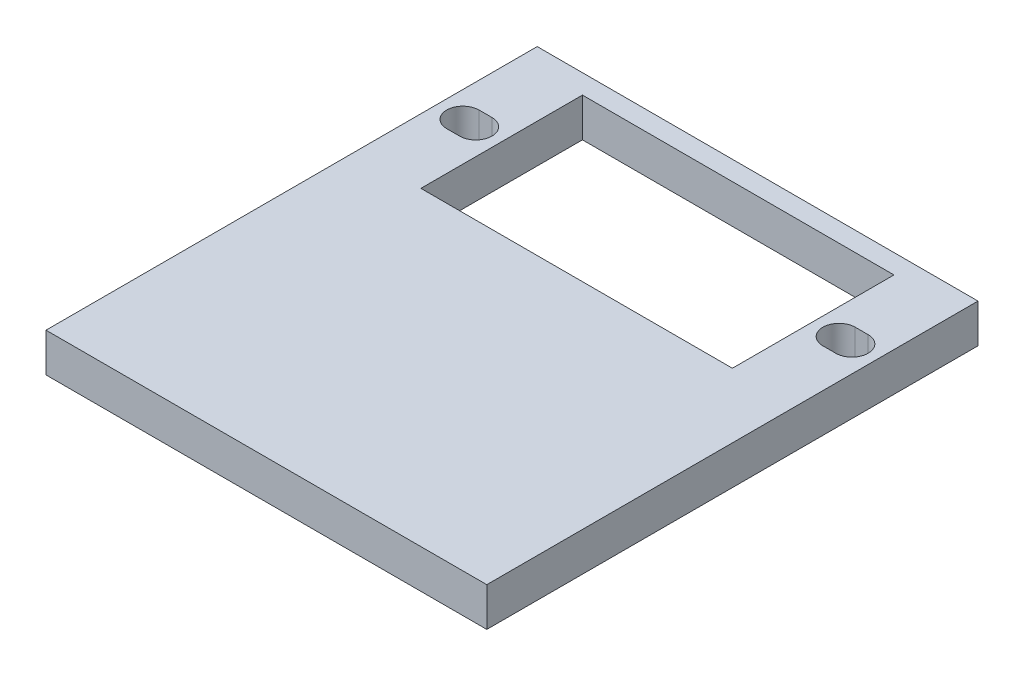
ISO-10303-21;
HEADER;
FILE_DESCRIPTION(('STEP AP214'),'2;1');
FILE_NAME('part.step','',(''),(''),'','','');
FILE_SCHEMA(('AUTOMOTIVE_DESIGN { 1 0 10303 214 1 1 1 1 }'));
ENDSEC;
DATA;
#1=APPLICATION_CONTEXT('core data for automotive mechanical design processes');
#2=APPLICATION_PROTOCOL_DEFINITION('international standard','automotive_design',2000,#1);
#3=PRODUCT_CONTEXT('',#1,'mechanical');
#4=PRODUCT('Part','Part','',(#3));
#5=PRODUCT_RELATED_PRODUCT_CATEGORY('part','',(#4));
#6=PRODUCT_DEFINITION_FORMATION('','',#4);
#7=PRODUCT_DEFINITION_CONTEXT('part definition',#1,'design');
#8=PRODUCT_DEFINITION('design','',#6,#7);
#9=PRODUCT_DEFINITION_SHAPE('','',#8);
#10=(LENGTH_UNIT() NAMED_UNIT(*) SI_UNIT(.MILLI.,.METRE.));
#11=(NAMED_UNIT(*) PLANE_ANGLE_UNIT() SI_UNIT($,.RADIAN.));
#12=(NAMED_UNIT(*) SI_UNIT($,.STERADIAN.) SOLID_ANGLE_UNIT());
#13=UNCERTAINTY_MEASURE_WITH_UNIT(LENGTH_MEASURE(1.E-05),#10,'distance_accuracy_value','');
#14=(GEOMETRIC_REPRESENTATION_CONTEXT(3) GLOBAL_UNCERTAINTY_ASSIGNED_CONTEXT((#13)) GLOBAL_UNIT_ASSIGNED_CONTEXT((#10,
#11,#12)) REPRESENTATION_CONTEXT('',''));
#15=CARTESIAN_POINT('',(0.,0.,0.));
#16=DIRECTION('',(0.,0.,1.));
#17=DIRECTION('',(1.,0.,0.));
#18=AXIS2_PLACEMENT_3D('',#15,#16,#17);
#19=CARTESIAN_POINT('',(0.,3.,-24.));
#20=DIRECTION('',(0.,0.,1.));
#21=DIRECTION('',(1.,0.,0.));
#22=AXIS2_PLACEMENT_3D('',#19,#20,#21);
#23=PLANE('',#22);
#24=DIRECTION('',(-1.,0.,0.));
#25=VECTOR('',#24,1.);
#26=CARTESIAN_POINT('',(0.,0.,-24.));
#27=LINE('',#26,#25);
#28=CARTESIAN_POINT('',(12.05,0.,-24.));
#29=VERTEX_POINT('',#28);
#30=CARTESIAN_POINT('',(-12.05,0.,-24.));
#31=VERTEX_POINT('',#30);
#32=EDGE_CURVE('E161',#29,#31,#27,.T.);
#33=ORIENTED_EDGE('',*,*,#32,.T.);
#34=DIRECTION('',(0.,-1.,0.));
#35=VECTOR('',#34,1.);
#36=CARTESIAN_POINT('',(-12.05,3.,-24.));
#37=LINE('',#36,#35);
#38=CARTESIAN_POINT('',(-12.05,3.,-24.));
#39=VERTEX_POINT('',#38);
#40=EDGE_CURVE('E11',#39,#31,#37,.T.);
#41=ORIENTED_EDGE('',*,*,#40,.F.);
#42=DIRECTION('',(-1.,0.,0.));
#43=VECTOR('',#42,1.);
#44=CARTESIAN_POINT('',(0.,3.,-24.));
#45=LINE('',#44,#43);
#46=CARTESIAN_POINT('',(12.05,3.,-24.));
#47=VERTEX_POINT('',#46);
#48=EDGE_CURVE('E131',#47,#39,#45,.T.);
#49=ORIENTED_EDGE('',*,*,#48,.F.);
#50=DIRECTION('',(0.,-1.,0.));
#51=VECTOR('',#50,1.);
#52=CARTESIAN_POINT('',(12.05,3.,-24.));
#53=LINE('',#52,#51);
#54=EDGE_CURVE('E211',#47,#29,#53,.T.);
#55=ORIENTED_EDGE('',*,*,#54,.T.);
#56=EDGE_LOOP('',(#33,#41,#49,#55));
#57=FACE_BOUND('',#56,.T.);
#58=ADVANCED_FACE('F35',(#57),#23,.F.);
#59=CARTESIAN_POINT('',(-12.05,3.,0.));
#60=DIRECTION('',(1.,0.,0.));
#61=DIRECTION('',(0.,0.,-1.));
#62=AXIS2_PLACEMENT_3D('',#59,#60,#61);
#63=PLANE('',#62);
#64=DIRECTION('',(0.,0.,1.));
#65=VECTOR('',#64,1.);
#66=CARTESIAN_POINT('',(-12.05,0.,0.));
#67=LINE('',#66,#65);
#68=CARTESIAN_POINT('',(-12.05,0.,-36.5));
#69=VERTEX_POINT('',#68);
#70=EDGE_CURVE('E116',#69,#31,#67,.T.);
#71=ORIENTED_EDGE('',*,*,#70,.F.);
#72=DIRECTION('',(0.,-1.,0.));
#73=VECTOR('',#72,1.);
#74=CARTESIAN_POINT('',(-12.05,3.,-36.5));
#75=LINE('',#74,#73);
#76=CARTESIAN_POINT('',(-12.05,3.,-36.5));
#77=VERTEX_POINT('',#76);
#78=EDGE_CURVE('E45',#77,#69,#75,.T.);
#79=ORIENTED_EDGE('',*,*,#78,.F.);
#80=DIRECTION('',(0.,0.,1.));
#81=VECTOR('',#80,1.);
#82=CARTESIAN_POINT('',(-12.05,3.,0.));
#83=LINE('',#82,#81);
#84=EDGE_CURVE('E114',#77,#39,#83,.T.);
#85=ORIENTED_EDGE('',*,*,#84,.T.);
#86=ORIENTED_EDGE('',*,*,#40,.T.);
#87=EDGE_LOOP('',(#71,#79,#85,#86));
#88=FACE_BOUND('',#87,.T.);
#89=ADVANCED_FACE('F113',(#88),#63,.T.);
#90=CARTESIAN_POINT('',(0.,3.,-36.5));
#91=DIRECTION('',(0.,0.,1.));
#92=DIRECTION('',(1.,0.,0.));
#93=AXIS2_PLACEMENT_3D('',#90,#91,#92);
#94=PLANE('',#93);
#95=DIRECTION('',(-1.,0.,0.));
#96=VECTOR('',#95,1.);
#97=CARTESIAN_POINT('',(0.,0.,-36.5));
#98=LINE('',#97,#96);
#99=CARTESIAN_POINT('',(12.05,0.,-36.5));
#100=VERTEX_POINT('',#99);
#101=EDGE_CURVE('E165',#100,#69,#98,.T.);
#102=ORIENTED_EDGE('',*,*,#101,.F.);
#103=DIRECTION('',(0.,-1.,0.));
#104=VECTOR('',#103,1.);
#105=CARTESIAN_POINT('',(12.05,3.,-36.5));
#106=LINE('',#105,#104);
#107=CARTESIAN_POINT('',(12.05,3.,-36.5));
#108=VERTEX_POINT('',#107);
#109=EDGE_CURVE('E137',#108,#100,#106,.T.);
#110=ORIENTED_EDGE('',*,*,#109,.F.);
#111=DIRECTION('',(-1.,0.,0.));
#112=VECTOR('',#111,1.);
#113=CARTESIAN_POINT('',(0.,3.,-36.5));
#114=LINE('',#113,#112);
#115=EDGE_CURVE('E128',#108,#77,#114,.T.);
#116=ORIENTED_EDGE('',*,*,#115,.T.);
#117=ORIENTED_EDGE('',*,*,#78,.T.);
#118=EDGE_LOOP('',(#102,#110,#116,#117));
#119=FACE_BOUND('',#118,.T.);
#120=ADVANCED_FACE('F135',(#119),#94,.T.);
#121=CARTESIAN_POINT('',(0.,3.,-38.));
#122=DIRECTION('',(0.,0.,1.));
#123=DIRECTION('',(1.,0.,0.));
#124=AXIS2_PLACEMENT_3D('',#121,#122,#123);
#125=PLANE('',#124);
#126=DIRECTION('',(-1.,0.,0.));
#127=VECTOR('',#126,1.);
#128=CARTESIAN_POINT('',(0.,0.,-38.));
#129=LINE('',#128,#127);
#130=CARTESIAN_POINT('',(17.05,0.,-38.));
#131=VERTEX_POINT('',#130);
#132=CARTESIAN_POINT('',(-17.05,0.,-38.));
#133=VERTEX_POINT('',#132);
#134=EDGE_CURVE('E167',#131,#133,#129,.T.);
#135=ORIENTED_EDGE('',*,*,#134,.T.);
#136=DIRECTION('',(0.,-1.,0.));
#137=VECTOR('',#136,1.);
#138=CARTESIAN_POINT('',(-17.05,3.,-38.));
#139=LINE('',#138,#137);
#140=CARTESIAN_POINT('',(-17.05,3.,-38.));
#141=VERTEX_POINT('',#140);
#142=EDGE_CURVE('E81',#141,#133,#139,.T.);
#143=ORIENTED_EDGE('',*,*,#142,.F.);
#144=DIRECTION('',(-1.,0.,0.));
#145=VECTOR('',#144,1.);
#146=CARTESIAN_POINT('',(0.,3.,-38.));
#147=LINE('',#146,#145);
#148=CARTESIAN_POINT('',(17.05,3.,-38.));
#149=VERTEX_POINT('',#148);
#150=EDGE_CURVE('E138',#149,#141,#147,.T.);
#151=ORIENTED_EDGE('',*,*,#150,.F.);
#152=DIRECTION('',(0.,-1.,0.));
#153=VECTOR('',#152,1.);
#154=CARTESIAN_POINT('',(17.05,3.,-38.));
#155=LINE('',#154,#153);
#156=EDGE_CURVE('E224',#149,#131,#155,.T.);
#157=ORIENTED_EDGE('',*,*,#156,.T.);
#158=EDGE_LOOP('',(#135,#143,#151,#157));
#159=FACE_BOUND('',#158,.T.);
#160=ADVANCED_FACE('F348',(#159),#125,.F.);
#161=CARTESIAN_POINT('',(-17.05,3.,0.));
#162=DIRECTION('',(-1.,0.,0.));
#163=DIRECTION('',(0.,0.,1.));
#164=AXIS2_PLACEMENT_3D('',#161,#162,#163);
#165=PLANE('',#164);
#166=DIRECTION('',(0.,0.,-1.));
#167=VECTOR('',#166,1.);
#168=CARTESIAN_POINT('',(-17.05,0.,0.));
#169=LINE('',#168,#167);
#170=CARTESIAN_POINT('',(-17.05,0.,0.));
#171=VERTEX_POINT('',#170);
#172=EDGE_CURVE('E169',#171,#133,#169,.T.);
#173=ORIENTED_EDGE('',*,*,#172,.F.);
#174=DIRECTION('',(0.,-1.,0.));
#175=VECTOR('',#174,1.);
#176=CARTESIAN_POINT('',(-17.05,3.,0.));
#177=LINE('',#176,#175);
#178=CARTESIAN_POINT('',(-17.05,3.,0.));
#179=VERTEX_POINT('',#178);
#180=EDGE_CURVE('E54',#179,#171,#177,.T.);
#181=ORIENTED_EDGE('',*,*,#180,.F.);
#182=DIRECTION('',(0.,0.,-1.));
#183=VECTOR('',#182,1.);
#184=CARTESIAN_POINT('',(-17.05,3.,0.));
#185=LINE('',#184,#183);
#186=EDGE_CURVE('E140',#179,#141,#185,.T.);
#187=ORIENTED_EDGE('',*,*,#186,.T.);
#188=ORIENTED_EDGE('',*,*,#142,.T.);
#189=EDGE_LOOP('',(#173,#181,#187,#188));
#190=FACE_BOUND('',#189,.T.);
#191=ADVANCED_FACE('F344',(#190),#165,.T.);
#192=CARTESIAN_POINT('',(-14.05,3.,-30.25));
#193=DIRECTION('',(0.,-1.,0.));
#194=DIRECTION('',(0.,0.,-1.));
#195=AXIS2_PLACEMENT_3D('',#192,#193,#194);
#196=CYLINDRICAL_SURFACE('',#195,1.25);
#197=CARTESIAN_POINT('',(-14.05,0.,-30.25));
#198=DIRECTION('',(0.,1.,0.));
#199=DIRECTION('',(0.,0.,1.));
#200=AXIS2_PLACEMENT_3D('',#197,#198,#199);
#201=CIRCLE('',#200,1.25);
#202=CARTESIAN_POINT('',(-14.05,0.,-29.));
#203=VERTEX_POINT('',#202);
#204=CARTESIAN_POINT('',(-14.05,0.,-31.5));
#205=VERTEX_POINT('',#204);
#206=EDGE_CURVE('E148',#203,#205,#201,.T.);
#207=ORIENTED_EDGE('',*,*,#206,.F.);
#208=DIRECTION('',(0.,-1.,0.));
#209=VECTOR('',#208,1.);
#210=CARTESIAN_POINT('',(-14.05,3.,-29.));
#211=LINE('',#210,#209);
#212=CARTESIAN_POINT('',(-14.05,3.,-29.));
#213=VERTEX_POINT('',#212);
#214=EDGE_CURVE('E39',#213,#203,#211,.T.);
#215=ORIENTED_EDGE('',*,*,#214,.F.);
#216=CARTESIAN_POINT('',(-14.05,3.,-30.25));
#217=DIRECTION('',(0.,1.,0.));
#218=DIRECTION('',(0.,0.,1.));
#219=AXIS2_PLACEMENT_3D('',#216,#217,#218);
#220=CIRCLE('',#219,1.25);
#221=CARTESIAN_POINT('',(-14.05,3.,-31.5));
#222=VERTEX_POINT('',#221);
#223=EDGE_CURVE('E175',#213,#222,#220,.T.);
#224=ORIENTED_EDGE('',*,*,#223,.T.);
#225=DIRECTION('',(0.,-1.,0.));
#226=VECTOR('',#225,1.);
#227=CARTESIAN_POINT('',(-14.05,3.,-31.5));
#228=LINE('',#227,#226);
#229=EDGE_CURVE('E147',#222,#205,#228,.T.);
#230=ORIENTED_EDGE('',*,*,#229,.T.);
#231=EDGE_LOOP('',(#207,#215,#224,#230));
#232=FACE_BOUND('',#231,.T.);
#233=ADVANCED_FACE('F37',(#232),#196,.F.);
#234=CARTESIAN_POINT('',(2.01227923213309E-13,3.,-28.9999999999999));
#235=DIRECTION('',(0.,0.,-1.));
#236=DIRECTION('',(-1.,0.,0.));
#237=AXIS2_PLACEMENT_3D('',#234,#235,#236);
#238=PLANE('',#237);
#239=DIRECTION('',(1.,0.,0.));
#240=VECTOR('',#239,1.);
#241=CARTESIAN_POINT('',(2.01227923213309E-13,0.,-28.9999999999999));
#242=LINE('',#241,#240);
#243=CARTESIAN_POINT('',(-15.05,0.,-29.));
#244=VERTEX_POINT('',#243);
#245=EDGE_CURVE('E151',#244,#203,#242,.T.);
#246=ORIENTED_EDGE('',*,*,#245,.F.);
#247=DIRECTION('',(0.,-1.,0.));
#248=VECTOR('',#247,1.);
#249=CARTESIAN_POINT('',(-15.05,3.,-29.));
#250=LINE('',#249,#248);
#251=CARTESIAN_POINT('',(-15.05,3.,-29.));
#252=VERTEX_POINT('',#251);
#253=EDGE_CURVE('E180',#252,#244,#250,.T.);
#254=ORIENTED_EDGE('',*,*,#253,.F.);
#255=DIRECTION('',(1.,0.,0.));
#256=VECTOR('',#255,1.);
#257=CARTESIAN_POINT('',(2.01227923213309E-13,3.,-28.9999999999999));
#258=LINE('',#257,#256);
#259=EDGE_CURVE('E189',#252,#213,#258,.T.);
#260=ORIENTED_EDGE('',*,*,#259,.T.);
#261=ORIENTED_EDGE('',*,*,#214,.T.);
#262=EDGE_LOOP('',(#246,#254,#260,#261));
#263=FACE_BOUND('',#262,.T.);
#264=ADVANCED_FACE('F187',(#263),#238,.T.);
#265=CARTESIAN_POINT('',(-15.05,3.,-30.25));
#266=DIRECTION('',(0.,-1.,0.));
#267=DIRECTION('',(0.,0.,-1.));
#268=AXIS2_PLACEMENT_3D('',#265,#266,#267);
#269=CYLINDRICAL_SURFACE('',#268,1.25);
#270=CARTESIAN_POINT('',(-15.05,0.,-30.25));
#271=DIRECTION('',(0.,1.,0.));
#272=DIRECTION('',(0.,0.,1.));
#273=AXIS2_PLACEMENT_3D('',#270,#271,#272);
#274=CIRCLE('',#273,1.25);
#275=CARTESIAN_POINT('',(-15.05,0.,-31.5));
#276=VERTEX_POINT('',#275);
#277=EDGE_CURVE('E155',#276,#244,#274,.T.);
#278=ORIENTED_EDGE('',*,*,#277,.F.);
#279=DIRECTION('',(0.,-1.,0.));
#280=VECTOR('',#279,1.);
#281=CARTESIAN_POINT('',(-15.05,3.,-31.5));
#282=LINE('',#281,#280);
#283=CARTESIAN_POINT('',(-15.05,3.,-31.5));
#284=VERTEX_POINT('',#283);
#285=EDGE_CURVE('E179',#284,#276,#282,.T.);
#286=ORIENTED_EDGE('',*,*,#285,.F.);
#287=CARTESIAN_POINT('',(-15.05,3.,-30.25));
#288=DIRECTION('',(0.,1.,0.));
#289=DIRECTION('',(0.,0.,1.));
#290=AXIS2_PLACEMENT_3D('',#287,#288,#289);
#291=CIRCLE('',#290,1.25);
#292=EDGE_CURVE('E198',#284,#252,#291,.T.);
#293=ORIENTED_EDGE('',*,*,#292,.T.);
#294=ORIENTED_EDGE('',*,*,#253,.T.);
#295=EDGE_LOOP('',(#278,#286,#293,#294));
#296=FACE_BOUND('',#295,.T.);
#297=ADVANCED_FACE('F195',(#296),#269,.F.);
#298=CARTESIAN_POINT('',(0.,3.,-31.5));
#299=DIRECTION('',(0.,0.,-1.));
#300=DIRECTION('',(-1.,0.,0.));
#301=AXIS2_PLACEMENT_3D('',#298,#299,#300);
#302=PLANE('',#301);
#303=DIRECTION('',(1.,0.,0.));
#304=VECTOR('',#303,1.);
#305=CARTESIAN_POINT('',(0.,0.,-31.5));
#306=LINE('',#305,#304);
#307=EDGE_CURVE('E158',#276,#205,#306,.T.);
#308=ORIENTED_EDGE('',*,*,#307,.T.);
#309=ORIENTED_EDGE('',*,*,#229,.F.);
#310=DIRECTION('',(1.,0.,0.));
#311=VECTOR('',#310,1.);
#312=CARTESIAN_POINT('',(0.,3.,-31.5));
#313=LINE('',#312,#311);
#314=EDGE_CURVE('E200',#284,#222,#313,.T.);
#315=ORIENTED_EDGE('',*,*,#314,.F.);
#316=ORIENTED_EDGE('',*,*,#285,.T.);
#317=EDGE_LOOP('',(#308,#309,#315,#316));
#318=FACE_BOUND('',#317,.T.);
#319=ADVANCED_FACE('F201',(#318),#302,.F.);
#320=CARTESIAN_POINT('',(0.,3.,0.));
#321=DIRECTION('',(0.,0.,1.));
#322=DIRECTION('',(1.,0.,0.));
#323=AXIS2_PLACEMENT_3D('',#320,#321,#322);
#324=PLANE('',#323);
#325=DIRECTION('',(-1.,0.,0.));
#326=VECTOR('',#325,1.);
#327=CARTESIAN_POINT('',(0.,0.,0.));
#328=LINE('',#327,#326);
#329=CARTESIAN_POINT('',(17.05,0.,0.));
#330=VERTEX_POINT('',#329);
#331=EDGE_CURVE('E172',#330,#171,#328,.T.);
#332=ORIENTED_EDGE('',*,*,#331,.F.);
#333=DIRECTION('',(0.,-1.,0.));
#334=VECTOR('',#333,1.);
#335=CARTESIAN_POINT('',(17.05,3.,0.));
#336=LINE('',#335,#334);
#337=CARTESIAN_POINT('',(17.05,3.,0.));
#338=VERTEX_POINT('',#337);
#339=EDGE_CURVE('E152',#338,#330,#336,.T.);
#340=ORIENTED_EDGE('',*,*,#339,.F.);
#341=DIRECTION('',(-1.,0.,0.));
#342=VECTOR('',#341,1.);
#343=CARTESIAN_POINT('',(0.,3.,0.));
#344=LINE('',#343,#342);
#345=EDGE_CURVE('E145',#338,#179,#344,.T.);
#346=ORIENTED_EDGE('',*,*,#345,.T.);
#347=ORIENTED_EDGE('',*,*,#180,.T.);
#348=EDGE_LOOP('',(#332,#340,#346,#347));
#349=FACE_BOUND('',#348,.T.);
#350=ADVANCED_FACE('F338',(#349),#324,.T.);
#351=CARTESIAN_POINT('',(0.,3.,0.));
#352=DIRECTION('',(0.,1.,0.));
#353=DIRECTION('',(0.,0.,1.));
#354=AXIS2_PLACEMENT_3D('',#351,#352,#353);
#355=PLANE('',#354);
#356=DIRECTION('',(0.,0.,1.));
#357=VECTOR('',#356,1.);
#358=CARTESIAN_POINT('',(12.05,3.,0.));
#359=LINE('',#358,#357);
#360=EDGE_CURVE('E221',#108,#47,#359,.T.);
#361=ORIENTED_EDGE('',*,*,#360,.T.);
#362=ORIENTED_EDGE('',*,*,#48,.T.);
#363=ORIENTED_EDGE('',*,*,#84,.F.);
#364=ORIENTED_EDGE('',*,*,#115,.F.);
#365=EDGE_LOOP('',(#361,#362,#363,#364));
#366=FACE_BOUND('',#365,.T.);
#367=ORIENTED_EDGE('',*,*,#223,.F.);
#368=ORIENTED_EDGE('',*,*,#259,.F.);
#369=ORIENTED_EDGE('',*,*,#292,.F.);
#370=ORIENTED_EDGE('',*,*,#314,.T.);
#371=EDGE_LOOP('',(#367,#368,#369,#370));
#372=FACE_BOUND('',#371,.T.);
#373=ORIENTED_EDGE('',*,*,#345,.F.);
#374=DIRECTION('',(0.,0.,-1.));
#375=VECTOR('',#374,1.);
#376=CARTESIAN_POINT('',(17.05,3.,0.));
#377=LINE('',#376,#375);
#378=EDGE_CURVE('E250',#338,#149,#377,.T.);
#379=ORIENTED_EDGE('',*,*,#378,.T.);
#380=ORIENTED_EDGE('',*,*,#150,.T.);
#381=ORIENTED_EDGE('',*,*,#186,.F.);
#382=EDGE_LOOP('',(#373,#379,#380,#381));
#383=FACE_BOUND('',#382,.T.);
#384=CARTESIAN_POINT('',(14.05,3.,-30.25));
#385=DIRECTION('',(0.,-1.,0.));
#386=DIRECTION('',(0.,0.,1.));
#387=AXIS2_PLACEMENT_3D('',#384,#385,#386);
#388=CIRCLE('',#387,1.25);
#389=CARTESIAN_POINT('',(14.05,3.,-29.));
#390=VERTEX_POINT('',#389);
#391=CARTESIAN_POINT('',(14.05,3.,-31.5));
#392=VERTEX_POINT('',#391);
#393=EDGE_CURVE('E233',#390,#392,#388,.T.);
#394=ORIENTED_EDGE('',*,*,#393,.T.);
#395=DIRECTION('',(-1.,0.,0.));
#396=VECTOR('',#395,1.);
#397=CARTESIAN_POINT('',(0.,3.,-31.5));
#398=LINE('',#397,#396);
#399=CARTESIAN_POINT('',(15.05,3.,-31.5));
#400=VERTEX_POINT('',#399);
#401=EDGE_CURVE('E259',#400,#392,#398,.T.);
#402=ORIENTED_EDGE('',*,*,#401,.F.);
#403=CARTESIAN_POINT('',(15.05,3.,-30.25));
#404=DIRECTION('',(0.,-1.,0.));
#405=DIRECTION('',(0.,0.,1.));
#406=AXIS2_PLACEMENT_3D('',#403,#404,#405);
#407=CIRCLE('',#406,1.25);
#408=CARTESIAN_POINT('',(15.05,3.,-29.));
#409=VERTEX_POINT('',#408);
#410=EDGE_CURVE('E256',#400,#409,#407,.T.);
#411=ORIENTED_EDGE('',*,*,#410,.T.);
#412=DIRECTION('',(-1.,0.,0.));
#413=VECTOR('',#412,1.);
#414=CARTESIAN_POINT('',(-2.01227923213309E-13,3.,-28.9999999999999));
#415=LINE('',#414,#413);
#416=EDGE_CURVE('E253',#409,#390,#415,.T.);
#417=ORIENTED_EDGE('',*,*,#416,.T.);
#418=EDGE_LOOP('',(#394,#402,#411,#417));
#419=FACE_BOUND('',#418,.T.);
#420=ADVANCED_FACE('F125',(#366,#372,#383,#419),#355,.T.);
#421=CARTESIAN_POINT('',(0.,0.,0.));
#422=DIRECTION('',(0.,1.,0.));
#423=DIRECTION('',(0.,0.,1.));
#424=AXIS2_PLACEMENT_3D('',#421,#422,#423);
#425=PLANE('',#424);
#426=ORIENTED_EDGE('',*,*,#32,.F.);
#427=DIRECTION('',(0.,0.,1.));
#428=VECTOR('',#427,1.);
#429=CARTESIAN_POINT('',(12.05,0.,0.));
#430=LINE('',#429,#428);
#431=EDGE_CURVE('E230',#100,#29,#430,.T.);
#432=ORIENTED_EDGE('',*,*,#431,.F.);
#433=ORIENTED_EDGE('',*,*,#101,.T.);
#434=ORIENTED_EDGE('',*,*,#70,.T.);
#435=EDGE_LOOP('',(#426,#432,#433,#434));
#436=FACE_BOUND('',#435,.T.);
#437=ORIENTED_EDGE('',*,*,#206,.T.);
#438=ORIENTED_EDGE('',*,*,#307,.F.);
#439=ORIENTED_EDGE('',*,*,#277,.T.);
#440=ORIENTED_EDGE('',*,*,#245,.T.);
#441=EDGE_LOOP('',(#437,#438,#439,#440));
#442=FACE_BOUND('',#441,.T.);
#443=DIRECTION('',(0.,0.,-1.));
#444=VECTOR('',#443,1.);
#445=CARTESIAN_POINT('',(17.05,0.,0.));
#446=LINE('',#445,#444);
#447=EDGE_CURVE('E234',#330,#131,#446,.T.);
#448=ORIENTED_EDGE('',*,*,#447,.F.);
#449=ORIENTED_EDGE('',*,*,#331,.T.);
#450=ORIENTED_EDGE('',*,*,#172,.T.);
#451=ORIENTED_EDGE('',*,*,#134,.F.);
#452=EDGE_LOOP('',(#448,#449,#450,#451));
#453=FACE_BOUND('',#452,.T.);
#454=CARTESIAN_POINT('',(14.05,0.,-30.25));
#455=DIRECTION('',(0.,-1.,0.));
#456=DIRECTION('',(0.,0.,1.));
#457=AXIS2_PLACEMENT_3D('',#454,#455,#456);
#458=CIRCLE('',#457,1.25);
#459=CARTESIAN_POINT('',(14.05,0.,-29.));
#460=VERTEX_POINT('',#459);
#461=CARTESIAN_POINT('',(14.05,0.,-31.5));
#462=VERTEX_POINT('',#461);
#463=EDGE_CURVE('E246',#460,#462,#458,.T.);
#464=ORIENTED_EDGE('',*,*,#463,.F.);
#465=DIRECTION('',(-1.,0.,0.));
#466=VECTOR('',#465,1.);
#467=CARTESIAN_POINT('',(-2.01227923213309E-13,0.,-28.9999999999999));
#468=LINE('',#467,#466);
#469=CARTESIAN_POINT('',(15.05,0.,-29.));
#470=VERTEX_POINT('',#469);
#471=EDGE_CURVE('E237',#470,#460,#468,.T.);
#472=ORIENTED_EDGE('',*,*,#471,.F.);
#473=CARTESIAN_POINT('',(15.05,0.,-30.25));
#474=DIRECTION('',(0.,-1.,0.));
#475=DIRECTION('',(0.,0.,1.));
#476=AXIS2_PLACEMENT_3D('',#473,#474,#475);
#477=CIRCLE('',#476,1.25);
#478=CARTESIAN_POINT('',(15.05,0.,-31.5));
#479=VERTEX_POINT('',#478);
#480=EDGE_CURVE('E240',#479,#470,#477,.T.);
#481=ORIENTED_EDGE('',*,*,#480,.F.);
#482=DIRECTION('',(-1.,0.,0.));
#483=VECTOR('',#482,1.);
#484=CARTESIAN_POINT('',(0.,0.,-31.5));
#485=LINE('',#484,#483);
#486=EDGE_CURVE('E243',#479,#462,#485,.T.);
#487=ORIENTED_EDGE('',*,*,#486,.T.);
#488=EDGE_LOOP('',(#464,#472,#481,#487));
#489=FACE_BOUND('',#488,.T.);
#490=ADVANCED_FACE('F193',(#436,#442,#453,#489),#425,.F.);
#491=CARTESIAN_POINT('',(17.05,3.,0.));
#492=DIRECTION('',(-1.,0.,0.));
#493=DIRECTION('',(0.,0.,1.));
#494=AXIS2_PLACEMENT_3D('',#491,#492,#493);
#495=PLANE('',#494);
#496=ORIENTED_EDGE('',*,*,#447,.T.);
#497=ORIENTED_EDGE('',*,*,#156,.F.);
#498=ORIENTED_EDGE('',*,*,#378,.F.);
#499=ORIENTED_EDGE('',*,*,#339,.T.);
#500=EDGE_LOOP('',(#496,#497,#498,#499));
#501=FACE_BOUND('',#500,.T.);
#502=ADVANCED_FACE('F319',(#501),#495,.F.);
#503=CARTESIAN_POINT('',(12.05,3.,0.));
#504=DIRECTION('',(1.,0.,0.));
#505=DIRECTION('',(0.,0.,-1.));
#506=AXIS2_PLACEMENT_3D('',#503,#504,#505);
#507=PLANE('',#506);
#508=ORIENTED_EDGE('',*,*,#431,.T.);
#509=ORIENTED_EDGE('',*,*,#54,.F.);
#510=ORIENTED_EDGE('',*,*,#360,.F.);
#511=ORIENTED_EDGE('',*,*,#109,.T.);
#512=EDGE_LOOP('',(#508,#509,#510,#511));
#513=FACE_BOUND('',#512,.T.);
#514=ADVANCED_FACE('F317',(#513),#507,.F.);
#515=CARTESIAN_POINT('',(14.05,3.,-30.25));
#516=DIRECTION('',(0.,-1.,0.));
#517=DIRECTION('',(0.,0.,-1.));
#518=AXIS2_PLACEMENT_3D('',#515,#516,#517);
#519=CYLINDRICAL_SURFACE('',#518,1.25);
#520=ORIENTED_EDGE('',*,*,#463,.T.);
#521=DIRECTION('',(0.,-1.,0.));
#522=VECTOR('',#521,1.);
#523=CARTESIAN_POINT('',(14.05,3.,-31.5));
#524=LINE('',#523,#522);
#525=EDGE_CURVE('E208',#392,#462,#524,.T.);
#526=ORIENTED_EDGE('',*,*,#525,.F.);
#527=ORIENTED_EDGE('',*,*,#393,.F.);
#528=DIRECTION('',(0.,-1.,0.));
#529=VECTOR('',#528,1.);
#530=CARTESIAN_POINT('',(14.05,3.,-29.));
#531=LINE('',#530,#529);
#532=EDGE_CURVE('E218',#390,#460,#531,.T.);
#533=ORIENTED_EDGE('',*,*,#532,.T.);
#534=EDGE_LOOP('',(#520,#526,#527,#533));
#535=FACE_BOUND('',#534,.T.);
#536=ADVANCED_FACE('F274',(#535),#519,.F.);
#537=CARTESIAN_POINT('',(0.,3.,-31.5));
#538=DIRECTION('',(0.,0.,1.));
#539=DIRECTION('',(1.,0.,0.));
#540=AXIS2_PLACEMENT_3D('',#537,#538,#539);
#541=PLANE('',#540);
#542=ORIENTED_EDGE('',*,*,#486,.F.);
#543=DIRECTION('',(0.,-1.,0.));
#544=VECTOR('',#543,1.);
#545=CARTESIAN_POINT('',(15.05,3.,-31.5));
#546=LINE('',#545,#544);
#547=EDGE_CURVE('E212',#400,#479,#546,.T.);
#548=ORIENTED_EDGE('',*,*,#547,.F.);
#549=ORIENTED_EDGE('',*,*,#401,.T.);
#550=ORIENTED_EDGE('',*,*,#525,.T.);
#551=EDGE_LOOP('',(#542,#548,#549,#550));
#552=FACE_BOUND('',#551,.T.);
#553=ADVANCED_FACE('F280',(#552),#541,.T.);
#554=CARTESIAN_POINT('',(15.05,3.,-30.25));
#555=DIRECTION('',(0.,-1.,0.));
#556=DIRECTION('',(0.,0.,-1.));
#557=AXIS2_PLACEMENT_3D('',#554,#555,#556);
#558=CYLINDRICAL_SURFACE('',#557,1.25);
#559=ORIENTED_EDGE('',*,*,#480,.T.);
#560=DIRECTION('',(0.,-1.,0.));
#561=VECTOR('',#560,1.);
#562=CARTESIAN_POINT('',(15.05,3.,-29.));
#563=LINE('',#562,#561);
#564=EDGE_CURVE('E215',#409,#470,#563,.T.);
#565=ORIENTED_EDGE('',*,*,#564,.F.);
#566=ORIENTED_EDGE('',*,*,#410,.F.);
#567=ORIENTED_EDGE('',*,*,#547,.T.);
#568=EDGE_LOOP('',(#559,#565,#566,#567));
#569=FACE_BOUND('',#568,.T.);
#570=ADVANCED_FACE('F288',(#569),#558,.F.);
#571=CARTESIAN_POINT('',(-2.01227923213309E-13,3.,-28.9999999999999));
#572=DIRECTION('',(0.,0.,1.));
#573=DIRECTION('',(1.,0.,0.));
#574=AXIS2_PLACEMENT_3D('',#571,#572,#573);
#575=PLANE('',#574);
#576=ORIENTED_EDGE('',*,*,#471,.T.);
#577=ORIENTED_EDGE('',*,*,#532,.F.);
#578=ORIENTED_EDGE('',*,*,#416,.F.);
#579=ORIENTED_EDGE('',*,*,#564,.T.);
#580=EDGE_LOOP('',(#576,#577,#578,#579));
#581=FACE_BOUND('',#580,.T.);
#582=ADVANCED_FACE('F425',(#581),#575,.F.);
#583=CLOSED_SHELL('',(#58,#89,#120,#160,#191,#233,#264,#297,#319,#350,#420,#490,#502,#514,#536,
#553,#570,#582));
#584=MANIFOLD_SOLID_BREP('B2',#583);
#585=ADVANCED_BREP_SHAPE_REPRESENTATION('',(#18,#584),#14);
#586=SHAPE_DEFINITION_REPRESENTATION(#9,#585);
ENDSEC;
END-ISO-10303-21;
